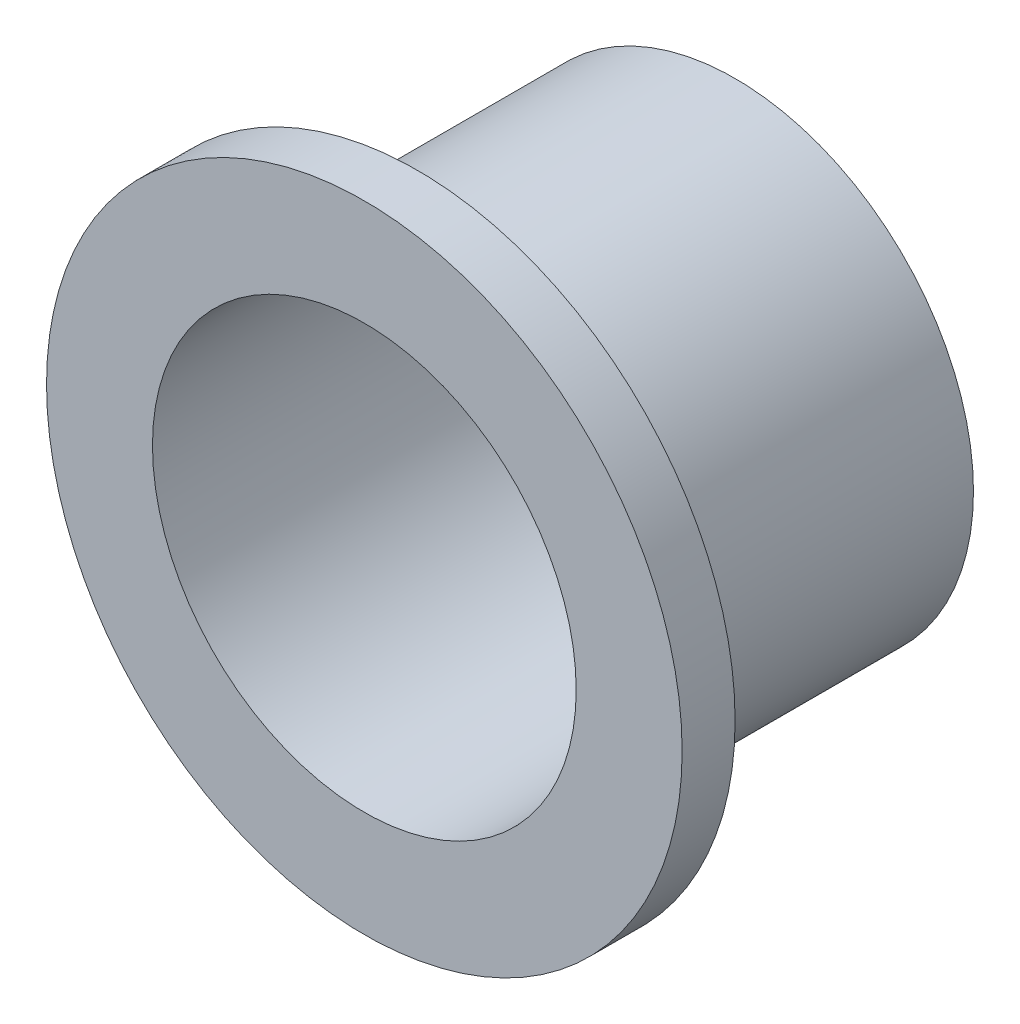
ISO-10303-21;
HEADER;
FILE_DESCRIPTION(('STEP AP214'),'2;1');
FILE_NAME('part.step','',(''),(''),'','','');
FILE_SCHEMA(('AUTOMOTIVE_DESIGN { 1 0 10303 214 1 1 1 1 }'));
ENDSEC;
DATA;
#1=APPLICATION_CONTEXT('core data for automotive mechanical design processes');
#2=APPLICATION_PROTOCOL_DEFINITION('international standard','automotive_design',2000,#1);
#3=PRODUCT_CONTEXT('',#1,'mechanical');
#4=PRODUCT('Part','Part','',(#3));
#5=PRODUCT_RELATED_PRODUCT_CATEGORY('part','',(#4));
#6=PRODUCT_DEFINITION_FORMATION('','',#4);
#7=PRODUCT_DEFINITION_CONTEXT('part definition',#1,'design');
#8=PRODUCT_DEFINITION('design','',#6,#7);
#9=PRODUCT_DEFINITION_SHAPE('','',#8);
#10=(LENGTH_UNIT() NAMED_UNIT(*) SI_UNIT(.MILLI.,.METRE.));
#11=(NAMED_UNIT(*) PLANE_ANGLE_UNIT() SI_UNIT($,.RADIAN.));
#12=(NAMED_UNIT(*) SI_UNIT($,.STERADIAN.) SOLID_ANGLE_UNIT());
#13=UNCERTAINTY_MEASURE_WITH_UNIT(LENGTH_MEASURE(1.E-05),#10,'distance_accuracy_value','');
#14=(GEOMETRIC_REPRESENTATION_CONTEXT(3) GLOBAL_UNCERTAINTY_ASSIGNED_CONTEXT((#13)) GLOBAL_UNIT_ASSIGNED_CONTEXT((#10,
#11,#12)) REPRESENTATION_CONTEXT('',''));
#15=CARTESIAN_POINT('',(0.,0.,0.));
#16=DIRECTION('',(0.,0.,1.));
#17=DIRECTION('',(1.,0.,0.));
#18=AXIS2_PLACEMENT_3D('',#15,#16,#17);
#19=CARTESIAN_POINT('',(0.,0.,22.225));
#20=DIRECTION('',(0.,0.,-1.));
#21=DIRECTION('',(-1.,0.,0.));
#22=AXIS2_PLACEMENT_3D('',#19,#20,#21);
#23=CYLINDRICAL_SURFACE('',#22,19.05);
#24=CARTESIAN_POINT('',(0.,0.,22.225));
#25=DIRECTION('',(0.,0.,1.));
#26=DIRECTION('',(1.,0.,0.));
#27=AXIS2_PLACEMENT_3D('',#24,#25,#26);
#28=CIRCLE('',#27,19.05);
#29=CARTESIAN_POINT('',(19.05,0.,22.225));
#30=VERTEX_POINT('',#29);
#31=EDGE_CURVE('E10',#30,#30,#28,.T.);
#32=ORIENTED_EDGE('',*,*,#31,.F.);
#33=EDGE_LOOP('',(#32));
#34=FACE_BOUND('',#33,.T.);
#35=CARTESIAN_POINT('',(0.,0.,19.05));
#36=DIRECTION('',(0.,0.,-1.));
#37=DIRECTION('',(-1.,0.,0.));
#38=AXIS2_PLACEMENT_3D('',#35,#36,#37);
#39=CIRCLE('',#38,19.05);
#40=CARTESIAN_POINT('',(-19.05,0.,19.05));
#41=VERTEX_POINT('',#40);
#42=EDGE_CURVE('E37',#41,#41,#39,.T.);
#43=ORIENTED_EDGE('',*,*,#42,.F.);
#44=EDGE_LOOP('',(#43));
#45=FACE_BOUND('',#44,.T.);
#46=ADVANCED_FACE('F31',(#34,#45),#23,.T.);
#47=CARTESIAN_POINT('',(0.,0.,22.225));
#48=DIRECTION('',(0.,0.,1.));
#49=DIRECTION('',(1.,0.,0.));
#50=AXIS2_PLACEMENT_3D('',#47,#48,#49);
#51=PLANE('',#50);
#52=CARTESIAN_POINT('',(0.,0.,22.225));
#53=DIRECTION('',(0.,0.,1.));
#54=DIRECTION('',(1.,0.,0.));
#55=AXIS2_PLACEMENT_3D('',#52,#53,#54);
#56=CIRCLE('',#55,12.7);
#57=CARTESIAN_POINT('',(12.7,0.,22.225));
#58=VERTEX_POINT('',#57);
#59=EDGE_CURVE('E51',#58,#58,#56,.T.);
#60=ORIENTED_EDGE('',*,*,#59,.F.);
#61=EDGE_LOOP('',(#60));
#62=FACE_BOUND('',#61,.T.);
#63=ORIENTED_EDGE('',*,*,#31,.T.);
#64=EDGE_LOOP('',(#63));
#65=FACE_BOUND('',#64,.T.);
#66=ADVANCED_FACE('F66',(#62,#65),#51,.T.);
#67=CARTESIAN_POINT('',(0.,0.,19.05));
#68=DIRECTION('',(0.,0.,-1.));
#69=DIRECTION('',(-1.,0.,0.));
#70=AXIS2_PLACEMENT_3D('',#67,#68,#69);
#71=PLANE('',#70);
#72=CARTESIAN_POINT('',(0.,0.,19.05));
#73=DIRECTION('',(0.,0.,-1.));
#74=DIRECTION('',(-1.,0.,0.));
#75=AXIS2_PLACEMENT_3D('',#72,#73,#74);
#76=CIRCLE('',#75,14.2875);
#77=CARTESIAN_POINT('',(-14.2875,0.,19.05));
#78=VERTEX_POINT('',#77);
#79=EDGE_CURVE('E41',#78,#78,#76,.T.);
#80=ORIENTED_EDGE('',*,*,#79,.F.);
#81=EDGE_LOOP('',(#80));
#82=FACE_BOUND('',#81,.T.);
#83=ORIENTED_EDGE('',*,*,#42,.T.);
#84=EDGE_LOOP('',(#83));
#85=FACE_BOUND('',#84,.T.);
#86=ADVANCED_FACE('F68',(#82,#85),#71,.T.);
#87=CARTESIAN_POINT('',(0.,0.,19.05));
#88=DIRECTION('',(0.,0.,-1.));
#89=DIRECTION('',(-1.,0.,0.));
#90=AXIS2_PLACEMENT_3D('',#87,#88,#89);
#91=CYLINDRICAL_SURFACE('',#90,14.2875);
#92=CARTESIAN_POINT('',(0.,0.,0.));
#93=DIRECTION('',(0.,0.,-1.));
#94=DIRECTION('',(-1.,0.,0.));
#95=AXIS2_PLACEMENT_3D('',#92,#93,#94);
#96=CIRCLE('',#95,14.2875);
#97=CARTESIAN_POINT('',(-14.2875,0.,0.));
#98=VERTEX_POINT('',#97);
#99=EDGE_CURVE('E45',#98,#98,#96,.T.);
#100=CARTESIAN_POINT('',(-14.2875,0.,19.05));
#101=CARTESIAN_POINT('',(-14.2875,0.,18.8515625));
#102=CARTESIAN_POINT('',(-14.2875,0.,18.653125));
#103=CARTESIAN_POINT('',(-14.2875,0.,18.25625));
#104=CARTESIAN_POINT('',(-14.2875,0.,18.0578125));
#105=CARTESIAN_POINT('',(-14.2875,0.,17.6609375));
#106=CARTESIAN_POINT('',(-14.2875,0.,17.4625));
#107=CARTESIAN_POINT('',(-14.2875,0.,17.065625));
#108=CARTESIAN_POINT('',(-14.2875,0.,16.8671875));
#109=CARTESIAN_POINT('',(-14.2875,0.,16.4703125));
#110=CARTESIAN_POINT('',(-14.2875,0.,16.271875));
#111=CARTESIAN_POINT('',(-14.2875,0.,15.875));
#112=CARTESIAN_POINT('',(-14.2875,0.,15.6765625));
#113=CARTESIAN_POINT('',(-14.2875,0.,15.2796875));
#114=CARTESIAN_POINT('',(-14.2875,0.,15.08125));
#115=CARTESIAN_POINT('',(-14.2875,0.,14.684375));
#116=CARTESIAN_POINT('',(-14.2875,0.,14.4859375));
#117=CARTESIAN_POINT('',(-14.2875,0.,14.0890625));
#118=CARTESIAN_POINT('',(-14.2875,0.,13.890625));
#119=CARTESIAN_POINT('',(-14.2875,0.,13.49375));
#120=CARTESIAN_POINT('',(-14.2875,0.,13.2953125));
#121=CARTESIAN_POINT('',(-14.2875,0.,12.8984375));
#122=CARTESIAN_POINT('',(-14.2875,0.,12.7));
#123=CARTESIAN_POINT('',(-14.2875,0.,12.303125));
#124=CARTESIAN_POINT('',(-14.2875,0.,12.1046875));
#125=CARTESIAN_POINT('',(-14.2875,0.,11.7078125));
#126=CARTESIAN_POINT('',(-14.2875,0.,11.509375));
#127=CARTESIAN_POINT('',(-14.2875,0.,11.1125));
#128=CARTESIAN_POINT('',(-14.2875,0.,10.9140625));
#129=CARTESIAN_POINT('',(-14.2875,0.,10.5171875));
#130=CARTESIAN_POINT('',(-14.2875,0.,10.31875));
#131=CARTESIAN_POINT('',(-14.2875,0.,9.921875));
#132=CARTESIAN_POINT('',(-14.2875,0.,9.7234375));
#133=CARTESIAN_POINT('',(-14.2875,0.,9.3265625));
#134=CARTESIAN_POINT('',(-14.2875,0.,9.128125));
#135=CARTESIAN_POINT('',(-14.2875,0.,8.73125));
#136=CARTESIAN_POINT('',(-14.2875,0.,8.5328125));
#137=CARTESIAN_POINT('',(-14.2875,0.,8.1359375));
#138=CARTESIAN_POINT('',(-14.2875,0.,7.9375));
#139=CARTESIAN_POINT('',(-14.2875,0.,7.540625));
#140=CARTESIAN_POINT('',(-14.2875,0.,7.3421875));
#141=CARTESIAN_POINT('',(-14.2875,0.,6.9453125));
#142=CARTESIAN_POINT('',(-14.2875,0.,6.746875));
#143=CARTESIAN_POINT('',(-14.2875,0.,6.35));
#144=CARTESIAN_POINT('',(-14.2875,0.,6.1515625));
#145=CARTESIAN_POINT('',(-14.2875,0.,5.7546875));
#146=CARTESIAN_POINT('',(-14.2875,0.,5.55625));
#147=CARTESIAN_POINT('',(-14.2875,0.,5.159375));
#148=CARTESIAN_POINT('',(-14.2875,0.,4.9609375));
#149=CARTESIAN_POINT('',(-14.2875,0.,4.5640625));
#150=CARTESIAN_POINT('',(-14.2875,0.,4.365625));
#151=CARTESIAN_POINT('',(-14.2875,0.,3.96875));
#152=CARTESIAN_POINT('',(-14.2875,0.,3.7703125));
#153=CARTESIAN_POINT('',(-14.2875,0.,3.3734375));
#154=CARTESIAN_POINT('',(-14.2875,0.,3.175));
#155=CARTESIAN_POINT('',(-14.2875,0.,2.778125));
#156=CARTESIAN_POINT('',(-14.2875,0.,2.5796875));
#157=CARTESIAN_POINT('',(-14.2875,0.,2.1828125));
#158=CARTESIAN_POINT('',(-14.2875,0.,1.984375));
#159=CARTESIAN_POINT('',(-14.2875,0.,1.5875));
#160=CARTESIAN_POINT('',(-14.2875,0.,1.3890625));
#161=CARTESIAN_POINT('',(-14.2875,0.,0.992187500000001));
#162=CARTESIAN_POINT('',(-14.2875,0.,0.793750000000001));
#163=CARTESIAN_POINT('',(-14.2875,0.,0.396875));
#164=CARTESIAN_POINT('',(-14.2875,0.,0.1984375));
#165=CARTESIAN_POINT('',(-14.2875,0.,0.));
#166=B_SPLINE_CURVE_WITH_KNOTS('',3,(#100,#101,#102,#103,#104,#105,#106,#107,#108,#109,#110,
#111,#112,#113,#114,#115,#116,#117,#118,#119,#120,#121,#122,#123,#124,#125,#126,#127,#128,#129,
#130,#131,#132,#133,#134,#135,#136,#137,#138,#139,#140,#141,#142,#143,#144,#145,#146,#147,#148,
#149,#150,#151,#152,#153,#154,#155,#156,#157,#158,#159,#160,#161,#162,#163,#164,#165),
.UNSPECIFIED.,.F.,.F.,(4,2,2,2,2,2,2,2,2,2,2,2,2,2,2,2,2,2,2,2,2,2,2,2,2,2,2,2,2,2,2,2,4),(0.,
0.595312499999997,1.190625,1.7859375,2.38125,2.9765625,3.571875,4.1671875,4.7625,5.3578125,
5.953125,6.5484375,7.14375,7.7390625,8.334375,8.9296875,9.525,10.1203125,10.715625,11.3109375,
11.90625,12.5015625,13.096875,13.6921875,14.2875,14.8828125,15.478125,16.0734375,16.66875,
17.2640625,17.859375,18.4546875,19.05),.UNSPECIFIED.);
#167=EDGE_CURVE('BSEAM74',#78,#98,#166,.T.);
#168=ORIENTED_EDGE('',*,*,#79,.T.);
#169=ORIENTED_EDGE('',*,*,#99,.F.);
#170=ORIENTED_EDGE('',*,*,#167,.T.);
#171=ORIENTED_EDGE('',*,*,#167,.F.);
#172=EDGE_LOOP('',(#168,#170,#169,#171));
#173=FACE_BOUND('',#172,.T.);
#174=ADVANCED_FACE('F74',(#173),#91,.T.);
#175=CARTESIAN_POINT('',(0.,0.,0.));
#176=DIRECTION('',(0.,0.,1.));
#177=DIRECTION('',(1.,0.,0.));
#178=AXIS2_PLACEMENT_3D('',#175,#176,#177);
#179=PLANE('',#178);
#180=CARTESIAN_POINT('',(0.,0.,0.));
#181=DIRECTION('',(0.,0.,1.));
#182=DIRECTION('',(1.,0.,0.));
#183=AXIS2_PLACEMENT_3D('',#180,#181,#182);
#184=CIRCLE('',#183,12.7);
#185=CARTESIAN_POINT('',(12.7,0.,0.));
#186=VERTEX_POINT('',#185);
#187=EDGE_CURVE('E49',#186,#186,#184,.T.);
#188=ORIENTED_EDGE('',*,*,#187,.T.);
#189=EDGE_LOOP('',(#188));
#190=FACE_BOUND('',#189,.T.);
#191=ORIENTED_EDGE('',*,*,#99,.T.);
#192=EDGE_LOOP('',(#191));
#193=FACE_BOUND('',#192,.T.);
#194=ADVANCED_FACE('F57',(#190,#193),#179,.F.);
#195=CARTESIAN_POINT('',(0.,0.,0.));
#196=DIRECTION('',(0.,0.,1.));
#197=DIRECTION('',(1.,0.,0.));
#198=AXIS2_PLACEMENT_3D('',#195,#196,#197);
#199=CYLINDRICAL_SURFACE('',#198,12.7);
#200=ORIENTED_EDGE('',*,*,#187,.F.);
#201=EDGE_LOOP('',(#200));
#202=FACE_BOUND('',#201,.T.);
#203=ORIENTED_EDGE('',*,*,#59,.T.);
#204=EDGE_LOOP('',(#203));
#205=FACE_BOUND('',#204,.T.);
#206=ADVANCED_FACE('F60',(#202,#205),#199,.F.);
#207=CLOSED_SHELL('',(#46,#66,#86,#174,#194,#206));
#208=MANIFOLD_SOLID_BREP('B2',#207);
#209=ADVANCED_BREP_SHAPE_REPRESENTATION('',(#18,#208),#14);
#210=SHAPE_DEFINITION_REPRESENTATION(#9,#209);
ENDSEC;
END-ISO-10303-21;
